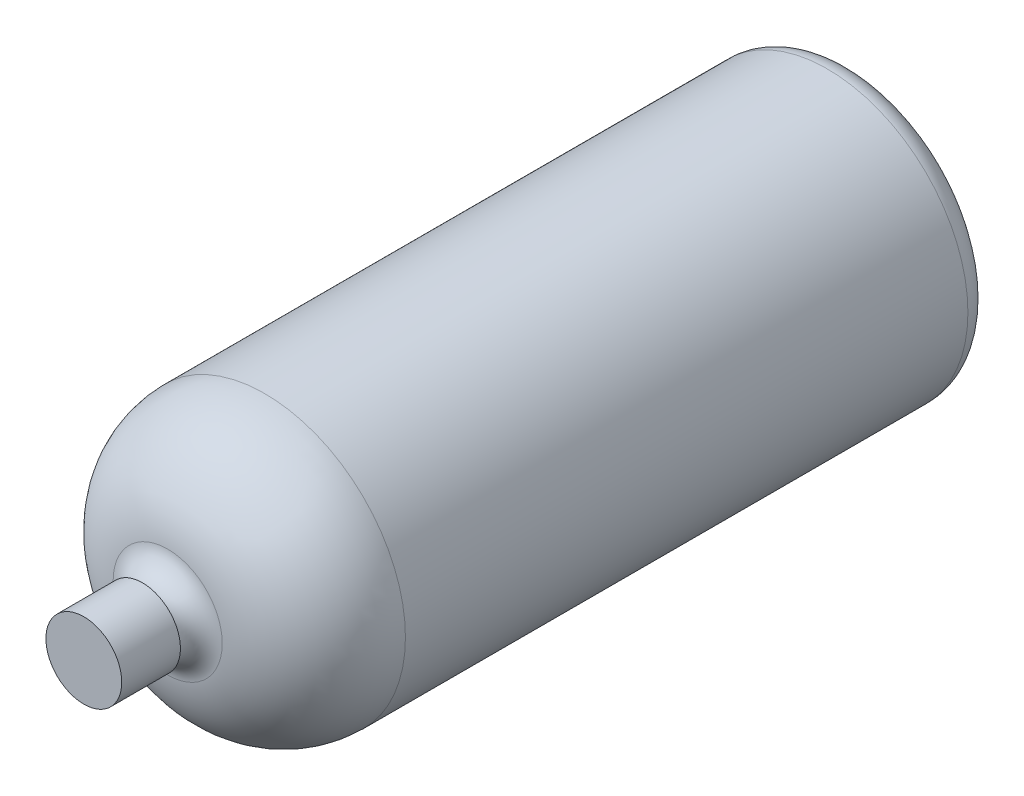
ISO-10303-21;
HEADER;
FILE_DESCRIPTION(('STEP AP214'),'2;1');
FILE_NAME('part.step','',(''),(''),'','','');
FILE_SCHEMA(('AUTOMOTIVE_DESIGN { 1 0 10303 214 1 1 1 1 }'));
ENDSEC;
DATA;
#1=APPLICATION_CONTEXT('core data for automotive mechanical design processes');
#2=APPLICATION_PROTOCOL_DEFINITION('international standard','automotive_design',2000,#1);
#3=PRODUCT_CONTEXT('',#1,'mechanical');
#4=PRODUCT('Part','Part','',(#3));
#5=PRODUCT_RELATED_PRODUCT_CATEGORY('part','',(#4));
#6=PRODUCT_DEFINITION_FORMATION('','',#4);
#7=PRODUCT_DEFINITION_CONTEXT('part definition',#1,'design');
#8=PRODUCT_DEFINITION('design','',#6,#7);
#9=PRODUCT_DEFINITION_SHAPE('','',#8);
#10=(LENGTH_UNIT() NAMED_UNIT(*) SI_UNIT(.MILLI.,.METRE.));
#11=(NAMED_UNIT(*) PLANE_ANGLE_UNIT() SI_UNIT($,.RADIAN.));
#12=(NAMED_UNIT(*) SI_UNIT($,.STERADIAN.) SOLID_ANGLE_UNIT());
#13=UNCERTAINTY_MEASURE_WITH_UNIT(LENGTH_MEASURE(1.E-05),#10,'distance_accuracy_value','');
#14=(GEOMETRIC_REPRESENTATION_CONTEXT(3) GLOBAL_UNCERTAINTY_ASSIGNED_CONTEXT((#13)) GLOBAL_UNIT_ASSIGNED_CONTEXT((#10,
#11,#12)) REPRESENTATION_CONTEXT('',''));
#15=CARTESIAN_POINT('',(0.,0.,0.));
#16=DIRECTION('',(0.,0.,1.));
#17=DIRECTION('',(1.,0.,0.));
#18=AXIS2_PLACEMENT_3D('',#15,#16,#17);
#19=CARTESIAN_POINT('',(0.,0.,280.));
#20=DIRECTION('',(0.,0.,-1.));
#21=DIRECTION('',(-1.,0.,0.));
#22=AXIS2_PLACEMENT_3D('',#19,#20,#21);
#23=CYLINDRICAL_SURFACE('',#22,57.5);
#24=CARTESIAN_POINT('',(0.,0.,10.));
#25=DIRECTION('',(0.,0.,1.));
#26=DIRECTION('',(1.,0.,0.));
#27=AXIS2_PLACEMENT_3D('',#24,#25,#26);
#28=CIRCLE('',#27,57.5);
#29=CARTESIAN_POINT('',(57.5,0.,10.));
#30=VERTEX_POINT('',#29);
#31=EDGE_CURVE('E39',#30,#30,#28,.T.);
#32=ORIENTED_EDGE('',*,*,#31,.T.);
#33=EDGE_LOOP('',(#32));
#34=FACE_BOUND('',#33,.T.);
#35=CARTESIAN_POINT('',(0.,0.,240.));
#36=DIRECTION('',(0.,0.,1.));
#37=DIRECTION('',(1.,0.,0.));
#38=AXIS2_PLACEMENT_3D('',#35,#36,#37);
#39=CIRCLE('',#38,57.5);
#40=CARTESIAN_POINT('',(57.5,0.,240.));
#41=VERTEX_POINT('',#40);
#42=EDGE_CURVE('E52',#41,#41,#39,.F.);
#43=ORIENTED_EDGE('',*,*,#42,.T.);
#44=EDGE_LOOP('',(#43));
#45=FACE_BOUND('',#44,.T.);
#46=ADVANCED_FACE('F32',(#34,#45),#23,.T.);
#47=CARTESIAN_POINT('',(0.,0.,0.));
#48=DIRECTION('',(0.,0.,1.));
#49=DIRECTION('',(1.,0.,0.));
#50=AXIS2_PLACEMENT_3D('',#47,#48,#49);
#51=PLANE('',#50);
#52=CARTESIAN_POINT('',(0.,0.,0.));
#53=DIRECTION('',(0.,0.,1.));
#54=DIRECTION('',(1.,0.,0.));
#55=AXIS2_PLACEMENT_3D('',#52,#53,#54);
#56=CIRCLE('',#55,47.5);
#57=CARTESIAN_POINT('',(47.5,0.,0.));
#58=VERTEX_POINT('',#57);
#59=EDGE_CURVE('E10',#58,#58,#56,.F.);
#60=ORIENTED_EDGE('',*,*,#59,.T.);
#61=EDGE_LOOP('',(#60));
#62=FACE_BOUND('',#61,.T.);
#63=ADVANCED_FACE('F86',(#62),#51,.F.);
#64=CARTESIAN_POINT('',(0.,0.,240.));
#65=DIRECTION('',(0.,0.,1.));
#66=DIRECTION('',(1.,0.,0.));
#67=AXIS2_PLACEMENT_3D('',#64,#65,#66);
#68=DEGENERATE_TOROIDAL_SURFACE('',#67,17.5,40.,.T.);
#69=CARTESIAN_POINT('',(0.,0.,279.710955667171));
#70=DIRECTION('',(0.,0.,-1.));
#71=DIRECTION('',(-1.,0.,0.));
#72=AXIS2_PLACEMENT_3D('',#69,#70,#71);
#73=CIRCLE('',#72,22.3);
#74=CARTESIAN_POINT('',(-22.3,0.,279.710955667171));
#75=VERTEX_POINT('',#74);
#76=EDGE_CURVE('E43',#75,#75,#73,.T.);
#77=ORIENTED_EDGE('',*,*,#76,.T.);
#78=EDGE_LOOP('',(#77));
#79=FACE_BOUND('',#78,.T.);
#80=ORIENTED_EDGE('',*,*,#42,.F.);
#81=EDGE_LOOP('',(#80));
#82=FACE_BOUND('',#81,.T.);
#83=ADVANCED_FACE('F91',(#79,#82),#68,.T.);
#84=CARTESIAN_POINT('',(0.,0.,290.));
#85=DIRECTION('',(0.,0.,-1.));
#86=DIRECTION('',(-1.,0.,0.));
#87=AXIS2_PLACEMENT_3D('',#84,#85,#86);
#88=CYLINDRICAL_SURFACE('',#87,13.5);
#89=CARTESIAN_POINT('',(0.,0.,289.638694583963));
#90=DIRECTION('',(0.,0.,1.));
#91=DIRECTION('',(1.,0.,0.));
#92=AXIS2_PLACEMENT_3D('',#89,#90,#91);
#93=CIRCLE('',#92,13.5);
#94=CARTESIAN_POINT('',(13.5,0.,289.638694583963));
#95=VERTEX_POINT('',#94);
#96=EDGE_CURVE('E47',#95,#95,#93,.T.);
#97=ORIENTED_EDGE('',*,*,#96,.T.);
#98=EDGE_LOOP('',(#97));
#99=FACE_BOUND('',#98,.T.);
#100=CARTESIAN_POINT('',(0.,0.,290.));
#101=DIRECTION('',(0.,0.,1.));
#102=DIRECTION('',(1.,0.,0.));
#103=AXIS2_PLACEMENT_3D('',#100,#101,#102);
#104=CIRCLE('',#103,13.5);
#105=CARTESIAN_POINT('',(13.5,0.,290.));
#106=VERTEX_POINT('',#105);
#107=EDGE_CURVE('E55',#106,#106,#104,.T.);
#108=ORIENTED_EDGE('',*,*,#107,.F.);
#109=EDGE_LOOP('',(#108));
#110=FACE_BOUND('',#109,.T.);
#111=ADVANCED_FACE('F70',(#99,#110),#88,.T.);
#112=CARTESIAN_POINT('',(0.,0.,314.));
#113=DIRECTION('',(0.,0.,-1.));
#114=DIRECTION('',(-1.,0.,0.));
#115=AXIS2_PLACEMENT_3D('',#112,#113,#114);
#116=CYLINDRICAL_SURFACE('',#115,15.5);
#117=CARTESIAN_POINT('',(0.,0.,314.));
#118=DIRECTION('',(0.,0.,1.));
#119=DIRECTION('',(1.,0.,0.));
#120=AXIS2_PLACEMENT_3D('',#117,#118,#119);
#121=CIRCLE('',#120,15.5);
#122=CARTESIAN_POINT('',(15.5,0.,314.));
#123=VERTEX_POINT('',#122);
#124=EDGE_CURVE('E58',#123,#123,#121,.T.);
#125=ORIENTED_EDGE('',*,*,#124,.F.);
#126=EDGE_LOOP('',(#125));
#127=FACE_BOUND('',#126,.T.);
#128=CARTESIAN_POINT('',(0.,0.,290.));
#129=DIRECTION('',(0.,0.,1.));
#130=DIRECTION('',(1.,0.,0.));
#131=AXIS2_PLACEMENT_3D('',#128,#129,#130);
#132=CIRCLE('',#131,15.5);
#133=CARTESIAN_POINT('',(15.5,0.,290.));
#134=VERTEX_POINT('',#133);
#135=EDGE_CURVE('E59',#134,#134,#132,.T.);
#136=ORIENTED_EDGE('',*,*,#135,.T.);
#137=EDGE_LOOP('',(#136));
#138=FACE_BOUND('',#137,.T.);
#139=ADVANCED_FACE('F67',(#127,#138),#116,.T.);
#140=CARTESIAN_POINT('',(0.,0.,314.));
#141=DIRECTION('',(0.,0.,1.));
#142=DIRECTION('',(1.,0.,0.));
#143=AXIS2_PLACEMENT_3D('',#140,#141,#142);
#144=PLANE('',#143);
#145=ORIENTED_EDGE('',*,*,#124,.T.);
#146=EDGE_LOOP('',(#145));
#147=FACE_BOUND('',#146,.T.);
#148=ADVANCED_FACE('F65',(#147),#144,.T.);
#149=CARTESIAN_POINT('',(0.,0.,290.));
#150=DIRECTION('',(0.,0.,1.));
#151=DIRECTION('',(1.,0.,0.));
#152=AXIS2_PLACEMENT_3D('',#149,#150,#151);
#153=PLANE('',#152);
#154=ORIENTED_EDGE('',*,*,#107,.T.);
#155=EDGE_LOOP('',(#154));
#156=FACE_BOUND('',#155,.T.);
#157=ORIENTED_EDGE('',*,*,#135,.F.);
#158=EDGE_LOOP('',(#157));
#159=FACE_BOUND('',#158,.T.);
#160=ADVANCED_FACE('F74',(#156,#159),#153,.F.);
#161=CARTESIAN_POINT('',(0.,0.,289.638694583963));
#162=DIRECTION('',(0.,0.,1.));
#163=DIRECTION('',(1.,0.,0.));
#164=AXIS2_PLACEMENT_3D('',#161,#162,#163);
#165=TOROIDAL_SURFACE('',#164,23.5,10.);
#166=ORIENTED_EDGE('',*,*,#76,.F.);
#167=EDGE_LOOP('',(#166));
#168=FACE_BOUND('',#167,.T.);
#169=ORIENTED_EDGE('',*,*,#96,.F.);
#170=EDGE_LOOP('',(#169));
#171=FACE_BOUND('',#170,.T.);
#172=ADVANCED_FACE('F76',(#168,#171),#165,.F.);
#173=CARTESIAN_POINT('',(0.,0.,10.));
#174=DIRECTION('',(0.,0.,1.));
#175=DIRECTION('',(1.,0.,0.));
#176=AXIS2_PLACEMENT_3D('',#173,#174,#175);
#177=TOROIDAL_SURFACE('',#176,47.5,10.);
#178=ORIENTED_EDGE('',*,*,#59,.F.);
#179=EDGE_LOOP('',(#178));
#180=FACE_BOUND('',#179,.T.);
#181=ORIENTED_EDGE('',*,*,#31,.F.);
#182=EDGE_LOOP('',(#181));
#183=FACE_BOUND('',#182,.T.);
#184=ADVANCED_FACE('F34',(#180,#183),#177,.T.);
#185=CLOSED_SHELL('',(#46,#63,#83,#111,#139,#148,#160,#172,#184));
#186=MANIFOLD_SOLID_BREP('B2',#185);
#187=ADVANCED_BREP_SHAPE_REPRESENTATION('',(#18,#186),#14);
#188=SHAPE_DEFINITION_REPRESENTATION(#9,#187);
ENDSEC;
END-ISO-10303-21;
